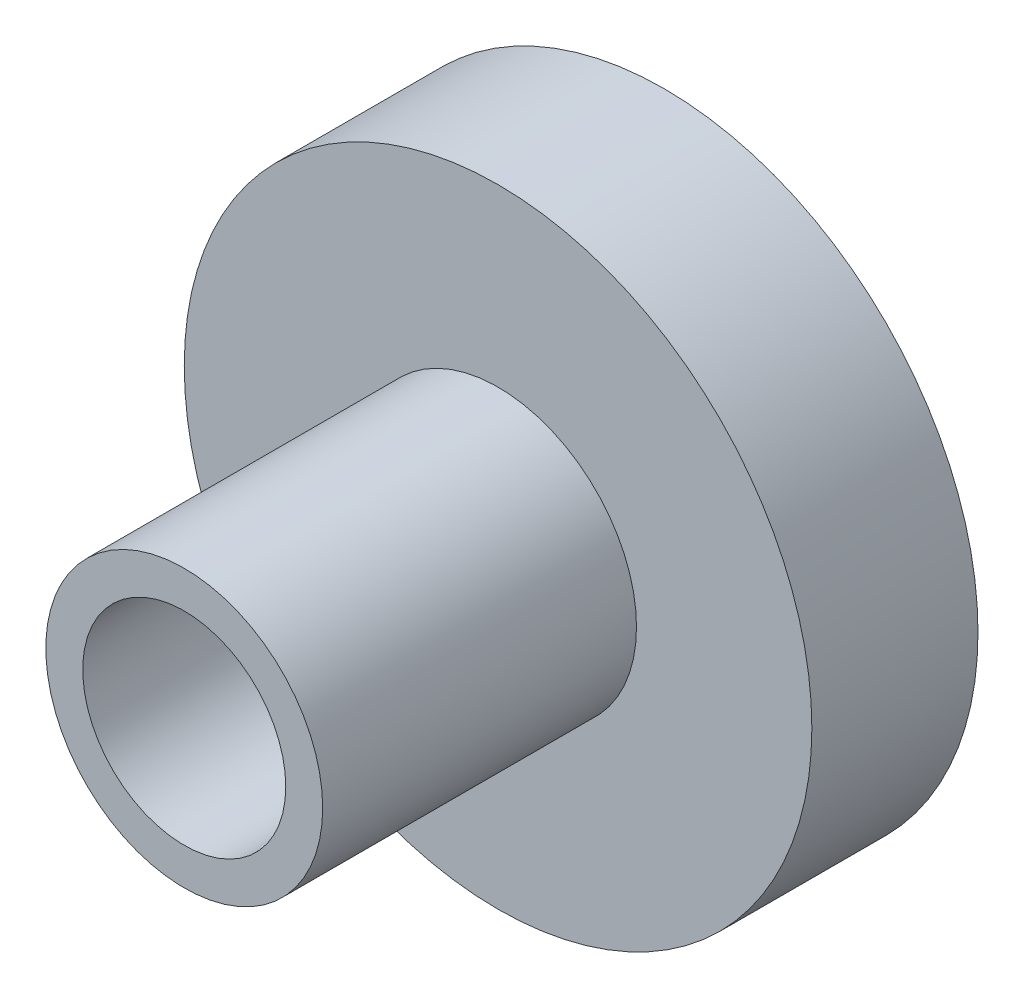
ISO-10303-21;
HEADER;
FILE_DESCRIPTION(('STEP AP214'),'2;1');
FILE_NAME('part.step','',(''),(''),'','','');
FILE_SCHEMA(('AUTOMOTIVE_DESIGN { 1 0 10303 214 1 1 1 1 }'));
ENDSEC;
DATA;
#1=APPLICATION_CONTEXT('core data for automotive mechanical design processes');
#2=APPLICATION_PROTOCOL_DEFINITION('international standard','automotive_design',2000,#1);
#3=PRODUCT_CONTEXT('',#1,'mechanical');
#4=PRODUCT('Part','Part','',(#3));
#5=PRODUCT_RELATED_PRODUCT_CATEGORY('part','',(#4));
#6=PRODUCT_DEFINITION_FORMATION('','',#4);
#7=PRODUCT_DEFINITION_CONTEXT('part definition',#1,'design');
#8=PRODUCT_DEFINITION('design','',#6,#7);
#9=PRODUCT_DEFINITION_SHAPE('','',#8);
#10=(LENGTH_UNIT() NAMED_UNIT(*) SI_UNIT(.MILLI.,.METRE.));
#11=(NAMED_UNIT(*) PLANE_ANGLE_UNIT() SI_UNIT($,.RADIAN.));
#12=(NAMED_UNIT(*) SI_UNIT($,.STERADIAN.) SOLID_ANGLE_UNIT());
#13=UNCERTAINTY_MEASURE_WITH_UNIT(LENGTH_MEASURE(1.E-05),#10,'distance_accuracy_value','');
#14=(GEOMETRIC_REPRESENTATION_CONTEXT(3) GLOBAL_UNCERTAINTY_ASSIGNED_CONTEXT((#13)) GLOBAL_UNIT_ASSIGNED_CONTEXT((#10,
#11,#12)) REPRESENTATION_CONTEXT('',''));
#15=CARTESIAN_POINT('',(0.,0.,0.));
#16=DIRECTION('',(0.,0.,1.));
#17=DIRECTION('',(1.,0.,0.));
#18=AXIS2_PLACEMENT_3D('',#15,#16,#17);
#19=CARTESIAN_POINT('',(0.,0.,0.));
#20=DIRECTION('',(0.,0.,1.));
#21=DIRECTION('',(1.,0.,0.));
#22=AXIS2_PLACEMENT_3D('',#19,#20,#21);
#23=CYLINDRICAL_SURFACE('',#22,2.75);
#24=CARTESIAN_POINT('',(0.,0.,13.));
#25=DIRECTION('',(0.,0.,1.));
#26=DIRECTION('',(1.,0.,0.));
#27=AXIS2_PLACEMENT_3D('',#24,#25,#26);
#28=CIRCLE('',#27,2.75);
#29=CARTESIAN_POINT('',(2.75,0.,13.));
#30=VERTEX_POINT('',#29);
#31=EDGE_CURVE('E10',#30,#30,#28,.T.);
#32=ORIENTED_EDGE('',*,*,#31,.T.);
#33=EDGE_LOOP('',(#32));
#34=FACE_BOUND('',#33,.T.);
#35=CARTESIAN_POINT('',(0.,0.,0.));
#36=DIRECTION('',(0.,0.,1.));
#37=DIRECTION('',(1.,0.,0.));
#38=AXIS2_PLACEMENT_3D('',#35,#36,#37);
#39=CIRCLE('',#38,2.75);
#40=CARTESIAN_POINT('',(2.75,0.,0.));
#41=VERTEX_POINT('',#40);
#42=EDGE_CURVE('E55',#41,#41,#39,.T.);
#43=ORIENTED_EDGE('',*,*,#42,.F.);
#44=EDGE_LOOP('',(#43));
#45=FACE_BOUND('',#44,.T.);
#46=ADVANCED_FACE('F33',(#34,#45),#23,.F.);
#47=CARTESIAN_POINT('',(2.75,0.,13.));
#48=DIRECTION('',(0.,0.,1.));
#49=DIRECTION('',(1.,0.,0.));
#50=AXIS2_PLACEMENT_3D('',#47,#48,#49);
#51=PLANE('',#50);
#52=CARTESIAN_POINT('',(0.,0.,13.));
#53=DIRECTION('',(0.,0.,1.));
#54=DIRECTION('',(1.,0.,0.));
#55=AXIS2_PLACEMENT_3D('',#52,#53,#54);
#56=CIRCLE('',#55,3.75);
#57=CARTESIAN_POINT('',(3.75,0.,13.));
#58=VERTEX_POINT('',#57);
#59=EDGE_CURVE('E39',#58,#58,#56,.T.);
#60=ORIENTED_EDGE('',*,*,#59,.T.);
#61=EDGE_LOOP('',(#60));
#62=FACE_BOUND('',#61,.T.);
#63=ORIENTED_EDGE('',*,*,#31,.F.);
#64=EDGE_LOOP('',(#63));
#65=FACE_BOUND('',#64,.T.);
#66=ADVANCED_FACE('F63',(#62,#65),#51,.T.);
#67=CARTESIAN_POINT('',(0.,0.,0.));
#68=DIRECTION('',(0.,0.,1.));
#69=DIRECTION('',(1.,0.,0.));
#70=AXIS2_PLACEMENT_3D('',#67,#68,#69);
#71=CYLINDRICAL_SURFACE('',#70,3.75);
#72=CARTESIAN_POINT('',(0.,0.,4.5));
#73=DIRECTION('',(0.,0.,1.));
#74=DIRECTION('',(1.,0.,0.));
#75=AXIS2_PLACEMENT_3D('',#72,#73,#74);
#76=CIRCLE('',#75,3.75);
#77=CARTESIAN_POINT('',(3.75,0.,4.5));
#78=VERTEX_POINT('',#77);
#79=EDGE_CURVE('E43',#78,#78,#76,.T.);
#80=ORIENTED_EDGE('',*,*,#79,.T.);
#81=EDGE_LOOP('',(#80));
#82=FACE_BOUND('',#81,.T.);
#83=ORIENTED_EDGE('',*,*,#59,.F.);
#84=EDGE_LOOP('',(#83));
#85=FACE_BOUND('',#84,.T.);
#86=ADVANCED_FACE('F67',(#82,#85),#71,.T.);
#87=CARTESIAN_POINT('',(3.75,0.,4.5));
#88=DIRECTION('',(0.,0.,1.));
#89=DIRECTION('',(1.,0.,0.));
#90=AXIS2_PLACEMENT_3D('',#87,#88,#89);
#91=PLANE('',#90);
#92=CARTESIAN_POINT('',(0.,0.,4.5));
#93=DIRECTION('',(0.,0.,1.));
#94=DIRECTION('',(1.,0.,0.));
#95=AXIS2_PLACEMENT_3D('',#92,#93,#94);
#96=CIRCLE('',#95,8.5);
#97=CARTESIAN_POINT('',(8.5,0.,4.5));
#98=VERTEX_POINT('',#97);
#99=EDGE_CURVE('E47',#98,#98,#96,.T.);
#100=ORIENTED_EDGE('',*,*,#99,.T.);
#101=EDGE_LOOP('',(#100));
#102=FACE_BOUND('',#101,.T.);
#103=ORIENTED_EDGE('',*,*,#79,.F.);
#104=EDGE_LOOP('',(#103));
#105=FACE_BOUND('',#104,.T.);
#106=ADVANCED_FACE('F71',(#102,#105),#91,.T.);
#107=CARTESIAN_POINT('',(0.,0.,0.));
#108=DIRECTION('',(0.,0.,1.));
#109=DIRECTION('',(1.,0.,0.));
#110=AXIS2_PLACEMENT_3D('',#107,#108,#109);
#111=CYLINDRICAL_SURFACE('',#110,8.5);
#112=CARTESIAN_POINT('',(0.,0.,0.));
#113=DIRECTION('',(0.,0.,1.));
#114=DIRECTION('',(1.,0.,0.));
#115=AXIS2_PLACEMENT_3D('',#112,#113,#114);
#116=CIRCLE('',#115,8.5);
#117=CARTESIAN_POINT('',(8.5,0.,0.));
#118=VERTEX_POINT('',#117);
#119=EDGE_CURVE('E52',#118,#118,#116,.T.);
#120=ORIENTED_EDGE('',*,*,#119,.T.);
#121=EDGE_LOOP('',(#120));
#122=FACE_BOUND('',#121,.T.);
#123=ORIENTED_EDGE('',*,*,#99,.F.);
#124=EDGE_LOOP('',(#123));
#125=FACE_BOUND('',#124,.T.);
#126=ADVANCED_FACE('F78',(#122,#125),#111,.T.);
#127=CARTESIAN_POINT('',(8.5,0.,0.));
#128=DIRECTION('',(0.,0.,-1.));
#129=DIRECTION('',(-1.,0.,0.));
#130=AXIS2_PLACEMENT_3D('',#127,#128,#129);
#131=PLANE('',#130);
#132=ORIENTED_EDGE('',*,*,#42,.T.);
#133=EDGE_LOOP('',(#132));
#134=FACE_BOUND('',#133,.T.);
#135=ORIENTED_EDGE('',*,*,#119,.F.);
#136=EDGE_LOOP('',(#135));
#137=FACE_BOUND('',#136,.T.);
#138=ADVANCED_FACE('F59',(#134,#137),#131,.T.);
#139=CLOSED_SHELL('',(#46,#66,#86,#106,#126,#138));
#140=MANIFOLD_SOLID_BREP('B2',#139);
#141=ADVANCED_BREP_SHAPE_REPRESENTATION('',(#18,#140),#14);
#142=SHAPE_DEFINITION_REPRESENTATION(#9,#141);
ENDSEC;
END-ISO-10303-21;
